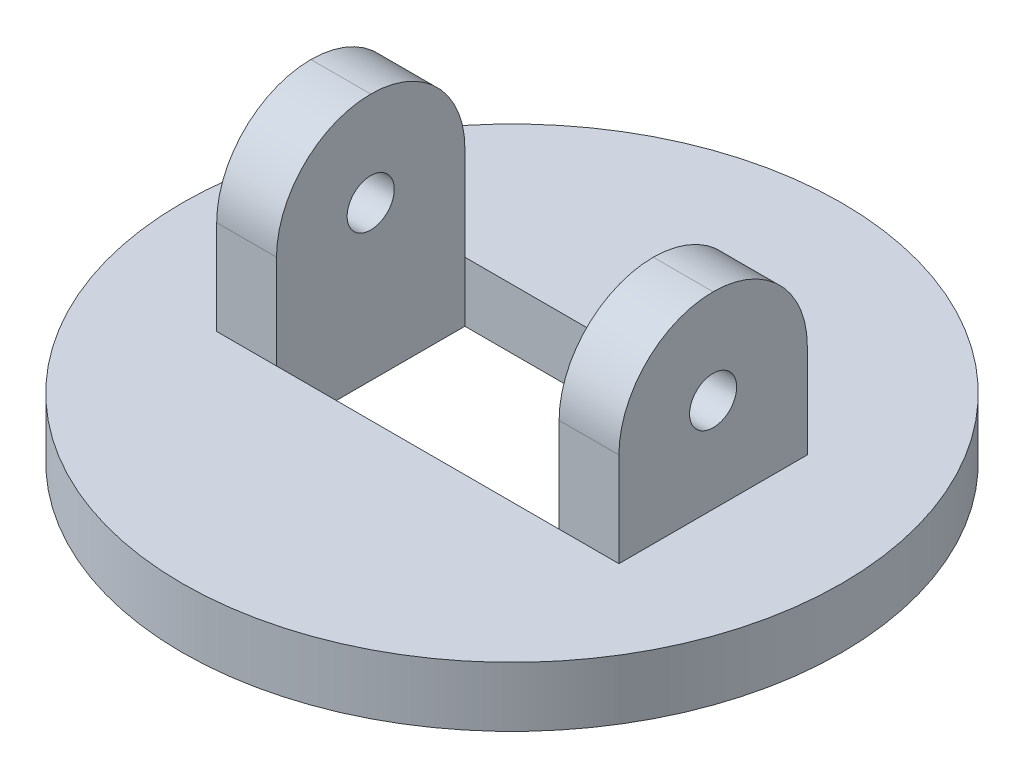
ISO-10303-21;
HEADER;
FILE_DESCRIPTION(('STEP AP214'),'2;1');
FILE_NAME('part.step','',(''),(''),'','','');
FILE_SCHEMA(('AUTOMOTIVE_DESIGN { 1 0 10303 214 1 1 1 1 }'));
ENDSEC;
DATA;
#1=APPLICATION_CONTEXT('core data for automotive mechanical design processes');
#2=APPLICATION_PROTOCOL_DEFINITION('international standard','automotive_design',2000,#1);
#3=PRODUCT_CONTEXT('',#1,'mechanical');
#4=PRODUCT('Part','Part','',(#3));
#5=PRODUCT_RELATED_PRODUCT_CATEGORY('part','',(#4));
#6=PRODUCT_DEFINITION_FORMATION('','',#4);
#7=PRODUCT_DEFINITION_CONTEXT('part definition',#1,'design');
#8=PRODUCT_DEFINITION('design','',#6,#7);
#9=PRODUCT_DEFINITION_SHAPE('','',#8);
#10=(LENGTH_UNIT() NAMED_UNIT(*) SI_UNIT(.MILLI.,.METRE.));
#11=(NAMED_UNIT(*) PLANE_ANGLE_UNIT() SI_UNIT($,.RADIAN.));
#12=(NAMED_UNIT(*) SI_UNIT($,.STERADIAN.) SOLID_ANGLE_UNIT());
#13=UNCERTAINTY_MEASURE_WITH_UNIT(LENGTH_MEASURE(1.E-05),#10,'distance_accuracy_value','');
#14=(GEOMETRIC_REPRESENTATION_CONTEXT(3) GLOBAL_UNCERTAINTY_ASSIGNED_CONTEXT((#13)) GLOBAL_UNIT_ASSIGNED_CONTEXT((#10,
#11,#12)) REPRESENTATION_CONTEXT('',''));
#15=CARTESIAN_POINT('',(0.,0.,0.));
#16=DIRECTION('',(0.,0.,1.));
#17=DIRECTION('',(1.,0.,0.));
#18=AXIS2_PLACEMENT_3D('',#15,#16,#17);
#19=CARTESIAN_POINT('',(0.,6.35,0.));
#20=DIRECTION('',(0.,1.,0.));
#21=DIRECTION('',(0.,0.,1.));
#22=AXIS2_PLACEMENT_3D('',#19,#20,#21);
#23=PLANE('',#22);
#24=DIRECTION('',(1.,0.,0.));
#25=VECTOR('',#24,1.);
#26=CARTESIAN_POINT('',(-15.,6.35,10.));
#27=LINE('',#26,#25);
#28=CARTESIAN_POINT('',(-21.35,6.35,10.));
#29=VERTEX_POINT('',#28);
#30=CARTESIAN_POINT('',(-15.,6.35,10.));
#31=VERTEX_POINT('',#30);
#32=EDGE_CURVE('E149',#29,#31,#27,.T.);
#33=ORIENTED_EDGE('',*,*,#32,.F.);
#34=DIRECTION('',(0.,0.,1.));
#35=VECTOR('',#34,1.);
#36=CARTESIAN_POINT('',(-21.35,6.35,-10.));
#37=LINE('',#36,#35);
#38=CARTESIAN_POINT('',(-21.35,6.35,-10.));
#39=VERTEX_POINT('',#38);
#40=EDGE_CURVE('E130',#39,#29,#37,.T.);
#41=ORIENTED_EDGE('',*,*,#40,.F.);
#42=DIRECTION('',(-1.,0.,0.));
#43=VECTOR('',#42,1.);
#44=CARTESIAN_POINT('',(-15.,6.35,-10.));
#45=LINE('',#44,#43);
#46=CARTESIAN_POINT('',(-15.,6.35,-10.));
#47=VERTEX_POINT('',#46);
#48=EDGE_CURVE('E145',#47,#39,#45,.T.);
#49=ORIENTED_EDGE('',*,*,#48,.F.);
#50=DIRECTION('',(-1.,0.,0.));
#51=VECTOR('',#50,1.);
#52=CARTESIAN_POINT('',(-15.,6.35,-10.));
#53=LINE('',#52,#51);
#54=CARTESIAN_POINT('',(15.,6.35,-10.));
#55=VERTEX_POINT('',#54);
#56=EDGE_CURVE('E180',#55,#47,#53,.T.);
#57=ORIENTED_EDGE('',*,*,#56,.F.);
#58=DIRECTION('',(-1.,0.,0.));
#59=VECTOR('',#58,1.);
#60=CARTESIAN_POINT('',(15.,6.35,-10.));
#61=LINE('',#60,#59);
#62=CARTESIAN_POINT('',(21.35,6.35,-10.));
#63=VERTEX_POINT('',#62);
#64=EDGE_CURVE('E175',#63,#55,#61,.T.);
#65=ORIENTED_EDGE('',*,*,#64,.F.);
#66=DIRECTION('',(0.,0.,-1.));
#67=VECTOR('',#66,1.);
#68=CARTESIAN_POINT('',(21.35,6.35,-10.));
#69=LINE('',#68,#67);
#70=CARTESIAN_POINT('',(21.35,6.35,9.99999999999999));
#71=VERTEX_POINT('',#70);
#72=EDGE_CURVE('E155',#71,#63,#69,.T.);
#73=ORIENTED_EDGE('',*,*,#72,.F.);
#74=DIRECTION('',(1.,0.,0.));
#75=VECTOR('',#74,1.);
#76=CARTESIAN_POINT('',(15.,6.35,10.));
#77=LINE('',#76,#75);
#78=CARTESIAN_POINT('',(15.,6.35,10.));
#79=VERTEX_POINT('',#78);
#80=EDGE_CURVE('E152',#79,#71,#77,.T.);
#81=ORIENTED_EDGE('',*,*,#80,.F.);
#82=DIRECTION('',(1.,0.,0.));
#83=VECTOR('',#82,1.);
#84=CARTESIAN_POINT('',(-15.,6.35,10.));
#85=LINE('',#84,#83);
#86=EDGE_CURVE('E182',#31,#79,#85,.T.);
#87=ORIENTED_EDGE('',*,*,#86,.F.);
#88=EDGE_LOOP('',(#33,#41,#49,#57,#65,#73,#81,#87));
#89=FACE_BOUND('',#88,.T.);
#90=CARTESIAN_POINT('',(0.,6.35,0.));
#91=DIRECTION('',(0.,1.,0.));
#92=DIRECTION('',(0.,0.,1.));
#93=AXIS2_PLACEMENT_3D('',#90,#91,#92);
#94=CIRCLE('',#93,35.);
#95=CARTESIAN_POINT('',(0.,6.35,35.));
#96=VERTEX_POINT('',#95);
#97=EDGE_CURVE('E207',#96,#96,#94,.T.);
#98=ORIENTED_EDGE('',*,*,#97,.T.);
#99=EDGE_LOOP('',(#98));
#100=FACE_BOUND('',#99,.T.);
#101=ADVANCED_FACE('F39',(#89,#100),#23,.T.);
#102=CARTESIAN_POINT('',(0.,0.,0.));
#103=DIRECTION('',(0.,1.,0.));
#104=DIRECTION('',(0.,0.,1.));
#105=AXIS2_PLACEMENT_3D('',#102,#103,#104);
#106=PLANE('',#105);
#107=CARTESIAN_POINT('',(0.,0.,0.));
#108=DIRECTION('',(0.,1.,0.));
#109=DIRECTION('',(0.,0.,1.));
#110=AXIS2_PLACEMENT_3D('',#107,#108,#109);
#111=CIRCLE('',#110,35.);
#112=CARTESIAN_POINT('',(0.,0.,35.));
#113=VERTEX_POINT('',#112);
#114=EDGE_CURVE('E206',#113,#113,#111,.T.);
#115=ORIENTED_EDGE('',*,*,#114,.F.);
#116=EDGE_LOOP('',(#115));
#117=FACE_BOUND('',#116,.T.);
#118=DIRECTION('',(0.,0.,-1.));
#119=VECTOR('',#118,1.);
#120=CARTESIAN_POINT('',(15.,0.,10.));
#121=LINE('',#120,#119);
#122=CARTESIAN_POINT('',(15.,0.,10.));
#123=VERTEX_POINT('',#122);
#124=CARTESIAN_POINT('',(15.,0.,-10.));
#125=VERTEX_POINT('',#124);
#126=EDGE_CURVE('E166',#123,#125,#121,.T.);
#127=ORIENTED_EDGE('',*,*,#126,.T.);
#128=DIRECTION('',(-1.,0.,0.));
#129=VECTOR('',#128,1.);
#130=CARTESIAN_POINT('',(-15.,0.,-10.));
#131=LINE('',#130,#129);
#132=CARTESIAN_POINT('',(-15.,0.,-10.));
#133=VERTEX_POINT('',#132);
#134=EDGE_CURVE('E189',#125,#133,#131,.T.);
#135=ORIENTED_EDGE('',*,*,#134,.T.);
#136=DIRECTION('',(0.,0.,1.));
#137=VECTOR('',#136,1.);
#138=CARTESIAN_POINT('',(-15.,0.,10.));
#139=LINE('',#138,#137);
#140=CARTESIAN_POINT('',(-15.,0.,10.));
#141=VERTEX_POINT('',#140);
#142=EDGE_CURVE('E192',#133,#141,#139,.T.);
#143=ORIENTED_EDGE('',*,*,#142,.T.);
#144=DIRECTION('',(1.,0.,0.));
#145=VECTOR('',#144,1.);
#146=CARTESIAN_POINT('',(-15.,0.,10.));
#147=LINE('',#146,#145);
#148=EDGE_CURVE('E183',#141,#123,#147,.T.);
#149=ORIENTED_EDGE('',*,*,#148,.T.);
#150=EDGE_LOOP('',(#127,#135,#143,#149));
#151=FACE_BOUND('',#150,.T.);
#152=ADVANCED_FACE('F293',(#117,#151),#106,.F.);
#153=CARTESIAN_POINT('',(0.,6.35,0.));
#154=DIRECTION('',(0.,-1.,0.));
#155=DIRECTION('',(0.,0.,-1.));
#156=AXIS2_PLACEMENT_3D('',#153,#154,#155);
#157=CYLINDRICAL_SURFACE('',#156,35.);
#158=ORIENTED_EDGE('',*,*,#97,.F.);
#159=EDGE_LOOP('',(#158));
#160=FACE_BOUND('',#159,.T.);
#161=ORIENTED_EDGE('',*,*,#114,.T.);
#162=EDGE_LOOP('',(#161));
#163=FACE_BOUND('',#162,.T.);
#164=ADVANCED_FACE('F300',(#160,#163),#157,.T.);
#165=CARTESIAN_POINT('',(15.,6.35,10.));
#166=DIRECTION('',(-1.,0.,0.));
#167=DIRECTION('',(0.,0.,1.));
#168=AXIS2_PLACEMENT_3D('',#165,#166,#167);
#169=PLANE('',#168);
#170=CARTESIAN_POINT('',(15.,16.35,0.));
#171=DIRECTION('',(-1.,0.,0.));
#172=DIRECTION('',(0.,0.,1.));
#173=AXIS2_PLACEMENT_3D('',#170,#171,#172);
#174=CIRCLE('',#173,2.5);
#175=CARTESIAN_POINT('',(15.,16.35,2.5));
#176=VERTEX_POINT('',#175);
#177=EDGE_CURVE('E158',#176,#176,#174,.T.);
#178=ORIENTED_EDGE('',*,*,#177,.F.);
#179=EDGE_LOOP('',(#178));
#180=FACE_BOUND('',#179,.T.);
#181=CARTESIAN_POINT('',(15.,16.35,0.));
#182=DIRECTION('',(-1.,0.,0.));
#183=DIRECTION('',(0.,0.,1.));
#184=AXIS2_PLACEMENT_3D('',#181,#182,#183);
#185=CIRCLE('',#184,10.);
#186=CARTESIAN_POINT('',(15.,16.35,10.));
#187=VERTEX_POINT('',#186);
#188=CARTESIAN_POINT('',(15.,26.35,0.));
#189=VERTEX_POINT('',#188);
#190=EDGE_CURVE('E210',#187,#189,#185,.T.);
#191=ORIENTED_EDGE('',*,*,#190,.T.);
#192=CARTESIAN_POINT('',(15.,16.35,0.));
#193=DIRECTION('',(-1.,0.,0.));
#194=DIRECTION('',(0.,0.,1.));
#195=AXIS2_PLACEMENT_3D('',#192,#193,#194);
#196=CIRCLE('',#195,10.);
#197=CARTESIAN_POINT('',(15.,16.35,-10.));
#198=VERTEX_POINT('',#197);
#199=EDGE_CURVE('E219',#189,#198,#196,.T.);
#200=ORIENTED_EDGE('',*,*,#199,.T.);
#201=DIRECTION('',(0.,-1.,0.));
#202=VECTOR('',#201,1.);
#203=CARTESIAN_POINT('',(15.,26.35,-10.));
#204=LINE('',#203,#202);
#205=EDGE_CURVE('E173',#198,#55,#204,.T.);
#206=ORIENTED_EDGE('',*,*,#205,.T.);
#207=DIRECTION('',(0.,-1.,0.));
#208=VECTOR('',#207,1.);
#209=CARTESIAN_POINT('',(15.,6.35,-10.));
#210=LINE('',#209,#208);
#211=EDGE_CURVE('E203',#55,#125,#210,.T.);
#212=ORIENTED_EDGE('',*,*,#211,.T.);
#213=ORIENTED_EDGE('',*,*,#126,.F.);
#214=DIRECTION('',(0.,-1.,0.));
#215=VECTOR('',#214,1.);
#216=CARTESIAN_POINT('',(15.,6.35,10.));
#217=LINE('',#216,#215);
#218=EDGE_CURVE('E186',#79,#123,#217,.T.);
#219=ORIENTED_EDGE('',*,*,#218,.F.);
#220=DIRECTION('',(0.,-1.,0.));
#221=VECTOR('',#220,1.);
#222=CARTESIAN_POINT('',(15.,26.35,10.));
#223=LINE('',#222,#221);
#224=EDGE_CURVE('E167',#187,#79,#223,.T.);
#225=ORIENTED_EDGE('',*,*,#224,.F.);
#226=EDGE_LOOP('',(#191,#200,#206,#212,#213,#219,#225));
#227=FACE_BOUND('',#226,.T.);
#228=ADVANCED_FACE('F269',(#180,#227),#169,.T.);
#229=CARTESIAN_POINT('',(-15.,6.35,-10.));
#230=DIRECTION('',(0.,0.,1.));
#231=DIRECTION('',(1.,0.,0.));
#232=AXIS2_PLACEMENT_3D('',#229,#230,#231);
#233=PLANE('',#232);
#234=ORIENTED_EDGE('',*,*,#134,.F.);
#235=ORIENTED_EDGE('',*,*,#211,.F.);
#236=ORIENTED_EDGE('',*,*,#56,.T.);
#237=DIRECTION('',(0.,-1.,0.));
#238=VECTOR('',#237,1.);
#239=CARTESIAN_POINT('',(-15.,6.35,-10.));
#240=LINE('',#239,#238);
#241=EDGE_CURVE('E201',#47,#133,#240,.T.);
#242=ORIENTED_EDGE('',*,*,#241,.T.);
#243=EDGE_LOOP('',(#234,#235,#236,#242));
#244=FACE_BOUND('',#243,.T.);
#245=ADVANCED_FACE('F379',(#244),#233,.T.);
#246=CARTESIAN_POINT('',(-15.,6.35,10.));
#247=DIRECTION('',(1.,0.,0.));
#248=DIRECTION('',(0.,0.,-1.));
#249=AXIS2_PLACEMENT_3D('',#246,#247,#248);
#250=PLANE('',#249);
#251=CARTESIAN_POINT('',(-15.,16.35,0.));
#252=DIRECTION('',(1.,0.,0.));
#253=DIRECTION('',(0.,0.,-1.));
#254=AXIS2_PLACEMENT_3D('',#251,#252,#253);
#255=CIRCLE('',#254,2.5);
#256=CARTESIAN_POINT('',(-15.,16.35,-2.5));
#257=VERTEX_POINT('',#256);
#258=EDGE_CURVE('E216',#257,#257,#255,.T.);
#259=ORIENTED_EDGE('',*,*,#258,.F.);
#260=EDGE_LOOP('',(#259));
#261=FACE_BOUND('',#260,.T.);
#262=DIRECTION('',(0.,-1.,0.));
#263=VECTOR('',#262,1.);
#264=CARTESIAN_POINT('',(-15.,26.35,-10.));
#265=LINE('',#264,#263);
#266=CARTESIAN_POINT('',(-15.,16.35,-10.));
#267=VERTEX_POINT('',#266);
#268=EDGE_CURVE('E137',#267,#47,#265,.T.);
#269=ORIENTED_EDGE('',*,*,#268,.F.);
#270=CARTESIAN_POINT('',(-15.,16.35,0.));
#271=DIRECTION('',(1.,0.,0.));
#272=DIRECTION('',(0.,0.,-1.));
#273=AXIS2_PLACEMENT_3D('',#270,#271,#272);
#274=CIRCLE('',#273,10.);
#275=CARTESIAN_POINT('',(-15.,26.35,0.));
#276=VERTEX_POINT('',#275);
#277=EDGE_CURVE('E48',#267,#276,#274,.T.);
#278=ORIENTED_EDGE('',*,*,#277,.T.);
#279=CARTESIAN_POINT('',(-15.,16.35,0.));
#280=DIRECTION('',(1.,0.,0.));
#281=DIRECTION('',(0.,0.,-1.));
#282=AXIS2_PLACEMENT_3D('',#279,#280,#281);
#283=CIRCLE('',#282,10.);
#284=CARTESIAN_POINT('',(-15.,16.35,10.));
#285=VERTEX_POINT('',#284);
#286=EDGE_CURVE('E56',#276,#285,#283,.T.);
#287=ORIENTED_EDGE('',*,*,#286,.T.);
#288=DIRECTION('',(0.,-1.,0.));
#289=VECTOR('',#288,1.);
#290=CARTESIAN_POINT('',(-15.,26.35,10.));
#291=LINE('',#290,#289);
#292=EDGE_CURVE('E162',#285,#31,#291,.T.);
#293=ORIENTED_EDGE('',*,*,#292,.T.);
#294=DIRECTION('',(0.,-1.,0.));
#295=VECTOR('',#294,1.);
#296=CARTESIAN_POINT('',(-15.,6.35,10.));
#297=LINE('',#296,#295);
#298=EDGE_CURVE('E199',#31,#141,#297,.T.);
#299=ORIENTED_EDGE('',*,*,#298,.T.);
#300=ORIENTED_EDGE('',*,*,#142,.F.);
#301=ORIENTED_EDGE('',*,*,#241,.F.);
#302=EDGE_LOOP('',(#269,#278,#287,#293,#299,#300,#301));
#303=FACE_BOUND('',#302,.T.);
#304=ADVANCED_FACE('F253',(#261,#303),#250,.T.);
#305=CARTESIAN_POINT('',(-15.,6.35,10.));
#306=DIRECTION('',(0.,0.,-1.));
#307=DIRECTION('',(-1.,0.,0.));
#308=AXIS2_PLACEMENT_3D('',#305,#306,#307);
#309=PLANE('',#308);
#310=ORIENTED_EDGE('',*,*,#148,.F.);
#311=ORIENTED_EDGE('',*,*,#298,.F.);
#312=ORIENTED_EDGE('',*,*,#86,.T.);
#313=ORIENTED_EDGE('',*,*,#218,.T.);
#314=EDGE_LOOP('',(#310,#311,#312,#313));
#315=FACE_BOUND('',#314,.T.);
#316=ADVANCED_FACE('F257',(#315),#309,.T.);
#317=CARTESIAN_POINT('',(15.,26.35,10.));
#318=DIRECTION('',(0.,0.,-1.));
#319=DIRECTION('',(-1.,0.,0.));
#320=AXIS2_PLACEMENT_3D('',#317,#318,#319);
#321=PLANE('',#320);
#322=DIRECTION('',(0.,-1.,0.));
#323=VECTOR('',#322,1.);
#324=CARTESIAN_POINT('',(21.35,26.35,9.99999999999999));
#325=LINE('',#324,#323);
#326=CARTESIAN_POINT('',(21.35,16.35,9.99999999999999));
#327=VERTEX_POINT('',#326);
#328=EDGE_CURVE('E169',#327,#71,#325,.T.);
#329=ORIENTED_EDGE('',*,*,#328,.F.);
#330=DIRECTION('',(1.,0.,0.));
#331=VECTOR('',#330,1.);
#332=CARTESIAN_POINT('',(15.,16.35,10.));
#333=LINE('',#332,#331);
#334=EDGE_CURVE('E228',#327,#187,#333,.F.);
#335=ORIENTED_EDGE('',*,*,#334,.T.);
#336=ORIENTED_EDGE('',*,*,#224,.T.);
#337=ORIENTED_EDGE('',*,*,#80,.T.);
#338=EDGE_LOOP('',(#329,#335,#336,#337));
#339=FACE_BOUND('',#338,.T.);
#340=ADVANCED_FACE('F264',(#339),#321,.F.);
#341=CARTESIAN_POINT('',(21.35,26.35,-10.));
#342=DIRECTION('',(-1.,0.,0.));
#343=DIRECTION('',(0.,0.,1.));
#344=AXIS2_PLACEMENT_3D('',#341,#342,#343);
#345=PLANE('',#344);
#346=CARTESIAN_POINT('',(21.35,16.35,0.));
#347=DIRECTION('',(1.,0.,0.));
#348=DIRECTION('',(0.,0.,-1.));
#349=AXIS2_PLACEMENT_3D('',#346,#347,#348);
#350=CIRCLE('',#349,2.5);
#351=CARTESIAN_POINT('',(21.35,16.35,-2.5));
#352=VERTEX_POINT('',#351);
#353=EDGE_CURVE('E217',#352,#352,#350,.T.);
#354=ORIENTED_EDGE('',*,*,#353,.F.);
#355=EDGE_LOOP('',(#354));
#356=FACE_BOUND('',#355,.T.);
#357=DIRECTION('',(0.,-1.,0.));
#358=VECTOR('',#357,1.);
#359=CARTESIAN_POINT('',(21.35,26.35,-10.));
#360=LINE('',#359,#358);
#361=CARTESIAN_POINT('',(21.35,16.35,-10.));
#362=VERTEX_POINT('',#361);
#363=EDGE_CURVE('E171',#362,#63,#360,.T.);
#364=ORIENTED_EDGE('',*,*,#363,.F.);
#365=CARTESIAN_POINT('',(21.35,16.35,0.));
#366=DIRECTION('',(-1.,0.,0.));
#367=DIRECTION('',(0.,0.,1.));
#368=AXIS2_PLACEMENT_3D('',#365,#366,#367);
#369=CIRCLE('',#368,10.);
#370=CARTESIAN_POINT('',(21.35,26.35,0.));
#371=VERTEX_POINT('',#370);
#372=EDGE_CURVE('E226',#362,#371,#369,.F.);
#373=ORIENTED_EDGE('',*,*,#372,.T.);
#374=CARTESIAN_POINT('',(21.35,16.35,0.));
#375=DIRECTION('',(-1.,0.,0.));
#376=DIRECTION('',(0.,0.,1.));
#377=AXIS2_PLACEMENT_3D('',#374,#375,#376);
#378=CIRCLE('',#377,10.);
#379=EDGE_CURVE('E224',#371,#327,#378,.F.);
#380=ORIENTED_EDGE('',*,*,#379,.T.);
#381=ORIENTED_EDGE('',*,*,#328,.T.);
#382=ORIENTED_EDGE('',*,*,#72,.T.);
#383=EDGE_LOOP('',(#364,#373,#380,#381,#382));
#384=FACE_BOUND('',#383,.T.);
#385=ADVANCED_FACE('F281',(#356,#384),#345,.F.);
#386=CARTESIAN_POINT('',(15.,26.35,-10.));
#387=DIRECTION('',(0.,0.,1.));
#388=DIRECTION('',(1.,0.,0.));
#389=AXIS2_PLACEMENT_3D('',#386,#387,#388);
#390=PLANE('',#389);
#391=ORIENTED_EDGE('',*,*,#205,.F.);
#392=DIRECTION('',(-1.,0.,0.));
#393=VECTOR('',#392,1.);
#394=CARTESIAN_POINT('',(21.35,16.35,-10.));
#395=LINE('',#394,#393);
#396=EDGE_CURVE('E221',#198,#362,#395,.F.);
#397=ORIENTED_EDGE('',*,*,#396,.T.);
#398=ORIENTED_EDGE('',*,*,#363,.T.);
#399=ORIENTED_EDGE('',*,*,#64,.T.);
#400=EDGE_LOOP('',(#391,#397,#398,#399));
#401=FACE_BOUND('',#400,.T.);
#402=ADVANCED_FACE('F278',(#401),#390,.F.);
#403=CARTESIAN_POINT('',(-15.,26.35,-10.));
#404=DIRECTION('',(0.,0.,1.));
#405=DIRECTION('',(1.,0.,0.));
#406=AXIS2_PLACEMENT_3D('',#403,#404,#405);
#407=PLANE('',#406);
#408=DIRECTION('',(0.,-1.,0.));
#409=VECTOR('',#408,1.);
#410=CARTESIAN_POINT('',(-21.35,26.35,-10.));
#411=LINE('',#410,#409);
#412=CARTESIAN_POINT('',(-21.35,16.35,-10.));
#413=VERTEX_POINT('',#412);
#414=EDGE_CURVE('E126',#413,#39,#411,.T.);
#415=ORIENTED_EDGE('',*,*,#414,.F.);
#416=DIRECTION('',(-1.,0.,0.));
#417=VECTOR('',#416,1.);
#418=CARTESIAN_POINT('',(-15.,16.35,-10.));
#419=LINE('',#418,#417);
#420=EDGE_CURVE('E233',#413,#267,#419,.F.);
#421=ORIENTED_EDGE('',*,*,#420,.T.);
#422=ORIENTED_EDGE('',*,*,#268,.T.);
#423=ORIENTED_EDGE('',*,*,#48,.T.);
#424=EDGE_LOOP('',(#415,#421,#422,#423));
#425=FACE_BOUND('',#424,.T.);
#426=ADVANCED_FACE('F151',(#425),#407,.F.);
#427=CARTESIAN_POINT('',(-21.35,26.35,-10.));
#428=DIRECTION('',(1.,0.,0.));
#429=DIRECTION('',(0.,0.,-1.));
#430=AXIS2_PLACEMENT_3D('',#427,#428,#429);
#431=PLANE('',#430);
#432=CARTESIAN_POINT('',(-21.35,16.35,0.));
#433=DIRECTION('',(1.,0.,0.));
#434=DIRECTION('',(0.,0.,-1.));
#435=AXIS2_PLACEMENT_3D('',#432,#433,#434);
#436=CIRCLE('',#435,2.5);
#437=CARTESIAN_POINT('',(-21.35,16.35,-2.5));
#438=VERTEX_POINT('',#437);
#439=EDGE_CURVE('E213',#438,#438,#436,.T.);
#440=ORIENTED_EDGE('',*,*,#439,.T.);
#441=EDGE_LOOP('',(#440));
#442=FACE_BOUND('',#441,.T.);
#443=CARTESIAN_POINT('',(-21.35,16.35,0.));
#444=DIRECTION('',(1.,0.,0.));
#445=DIRECTION('',(0.,0.,-1.));
#446=AXIS2_PLACEMENT_3D('',#443,#444,#445);
#447=CIRCLE('',#446,10.);
#448=CARTESIAN_POINT('',(-21.35,16.35,10.));
#449=VERTEX_POINT('',#448);
#450=CARTESIAN_POINT('',(-21.35,26.35,0.));
#451=VERTEX_POINT('',#450);
#452=EDGE_CURVE('E230',#449,#451,#447,.F.);
#453=ORIENTED_EDGE('',*,*,#452,.T.);
#454=CARTESIAN_POINT('',(-21.35,16.35,0.));
#455=DIRECTION('',(1.,0.,0.));
#456=DIRECTION('',(0.,0.,-1.));
#457=AXIS2_PLACEMENT_3D('',#454,#455,#456);
#458=CIRCLE('',#457,10.);
#459=EDGE_CURVE('E132',#451,#413,#458,.F.);
#460=ORIENTED_EDGE('',*,*,#459,.T.);
#461=ORIENTED_EDGE('',*,*,#414,.T.);
#462=ORIENTED_EDGE('',*,*,#40,.T.);
#463=DIRECTION('',(0.,-1.,0.));
#464=VECTOR('',#463,1.);
#465=CARTESIAN_POINT('',(-21.35,26.35,10.));
#466=LINE('',#465,#464);
#467=EDGE_CURVE('E138',#449,#29,#466,.T.);
#468=ORIENTED_EDGE('',*,*,#467,.F.);
#469=EDGE_LOOP('',(#453,#460,#461,#462,#468));
#470=FACE_BOUND('',#469,.T.);
#471=ADVANCED_FACE('F128',(#442,#470),#431,.F.);
#472=CARTESIAN_POINT('',(-15.,26.35,10.));
#473=DIRECTION('',(0.,0.,-1.));
#474=DIRECTION('',(-1.,0.,0.));
#475=AXIS2_PLACEMENT_3D('',#472,#473,#474);
#476=PLANE('',#475);
#477=ORIENTED_EDGE('',*,*,#292,.F.);
#478=DIRECTION('',(1.,0.,0.));
#479=VECTOR('',#478,1.);
#480=CARTESIAN_POINT('',(-15.,16.35,10.));
#481=LINE('',#480,#479);
#482=EDGE_CURVE('E11',#285,#449,#481,.F.);
#483=ORIENTED_EDGE('',*,*,#482,.T.);
#484=ORIENTED_EDGE('',*,*,#467,.T.);
#485=ORIENTED_EDGE('',*,*,#32,.T.);
#486=EDGE_LOOP('',(#477,#483,#484,#485));
#487=FACE_BOUND('',#486,.T.);
#488=ADVANCED_FACE('F251',(#487),#476,.F.);
#489=CARTESIAN_POINT('',(-35.65,16.35,0.));
#490=DIRECTION('',(1.,0.,0.));
#491=DIRECTION('',(0.,0.,-1.));
#492=AXIS2_PLACEMENT_3D('',#489,#490,#491);
#493=CYLINDRICAL_SURFACE('',#492,2.5);
#494=ORIENTED_EDGE('',*,*,#258,.T.);
#495=EDGE_LOOP('',(#494));
#496=FACE_BOUND('',#495,.T.);
#497=ORIENTED_EDGE('',*,*,#439,.F.);
#498=EDGE_LOOP('',(#497));
#499=FACE_BOUND('',#498,.T.);
#500=ADVANCED_FACE('F336',(#496,#499),#493,.F.);
#501=ORIENTED_EDGE('',*,*,#177,.T.);
#502=EDGE_LOOP('',(#501));
#503=FACE_BOUND('',#502,.T.);
#504=ORIENTED_EDGE('',*,*,#353,.T.);
#505=EDGE_LOOP('',(#504));
#506=FACE_BOUND('',#505,.T.);
#507=ADVANCED_FACE('F311',(#503,#506),#493,.F.);
#508=CARTESIAN_POINT('',(0.,16.35,0.));
#509=DIRECTION('',(-1.,0.,0.));
#510=DIRECTION('',(0.,0.,1.));
#511=AXIS2_PLACEMENT_3D('',#508,#509,#510);
#512=CYLINDRICAL_SURFACE('',#511,10.);
#513=ORIENTED_EDGE('',*,*,#334,.F.);
#514=ORIENTED_EDGE('',*,*,#379,.F.);
#515=DIRECTION('',(1.,0.,0.));
#516=VECTOR('',#515,1.);
#517=CARTESIAN_POINT('',(21.35,26.35,0.));
#518=LINE('',#517,#516);
#519=EDGE_CURVE('E236',#189,#371,#518,.T.);
#520=ORIENTED_EDGE('',*,*,#519,.F.);
#521=ORIENTED_EDGE('',*,*,#190,.F.);
#522=EDGE_LOOP('',(#513,#514,#520,#521));
#523=FACE_BOUND('',#522,.T.);
#524=ADVANCED_FACE('F271',(#523),#512,.T.);
#525=CARTESIAN_POINT('',(0.,16.35,0.));
#526=DIRECTION('',(1.,0.,0.));
#527=DIRECTION('',(0.,0.,-1.));
#528=AXIS2_PLACEMENT_3D('',#525,#526,#527);
#529=CYLINDRICAL_SURFACE('',#528,10.);
#530=ORIENTED_EDGE('',*,*,#372,.F.);
#531=ORIENTED_EDGE('',*,*,#396,.F.);
#532=ORIENTED_EDGE('',*,*,#199,.F.);
#533=ORIENTED_EDGE('',*,*,#519,.T.);
#534=EDGE_LOOP('',(#530,#531,#532,#533));
#535=FACE_BOUND('',#534,.T.);
#536=ADVANCED_FACE('F274',(#535),#529,.T.);
#537=CARTESIAN_POINT('',(0.,16.35,0.));
#538=DIRECTION('',(1.,0.,0.));
#539=DIRECTION('',(0.,0.,-1.));
#540=AXIS2_PLACEMENT_3D('',#537,#538,#539);
#541=CYLINDRICAL_SURFACE('',#540,10.);
#542=ORIENTED_EDGE('',*,*,#482,.F.);
#543=ORIENTED_EDGE('',*,*,#286,.F.);
#544=DIRECTION('',(1.,0.,0.));
#545=VECTOR('',#544,1.);
#546=CARTESIAN_POINT('',(0.,26.35,0.));
#547=LINE('',#546,#545);
#548=EDGE_CURVE('E43',#451,#276,#547,.T.);
#549=ORIENTED_EDGE('',*,*,#548,.F.);
#550=ORIENTED_EDGE('',*,*,#452,.F.);
#551=EDGE_LOOP('',(#542,#543,#549,#550));
#552=FACE_BOUND('',#551,.T.);
#553=ADVANCED_FACE('F41',(#552),#541,.T.);
#554=CARTESIAN_POINT('',(0.,16.35,0.));
#555=DIRECTION('',(-1.,0.,0.));
#556=DIRECTION('',(0.,0.,1.));
#557=AXIS2_PLACEMENT_3D('',#554,#555,#556);
#558=CYLINDRICAL_SURFACE('',#557,10.);
#559=ORIENTED_EDGE('',*,*,#277,.F.);
#560=ORIENTED_EDGE('',*,*,#420,.F.);
#561=ORIENTED_EDGE('',*,*,#459,.F.);
#562=ORIENTED_EDGE('',*,*,#548,.T.);
#563=EDGE_LOOP('',(#559,#560,#561,#562));
#564=FACE_BOUND('',#563,.T.);
#565=ADVANCED_FACE('F246',(#564),#558,.T.);
#566=CLOSED_SHELL('',(#101,#152,#164,#228,#245,#304,#316,#340,#385,#402,#426,#471,#488,#500,
#507,#524,#536,#553,#565));
#567=MANIFOLD_SOLID_BREP('B2',#566);
#568=ADVANCED_BREP_SHAPE_REPRESENTATION('',(#18,#567),#14);
#569=SHAPE_DEFINITION_REPRESENTATION(#9,#568);
ENDSEC;
END-ISO-10303-21;
